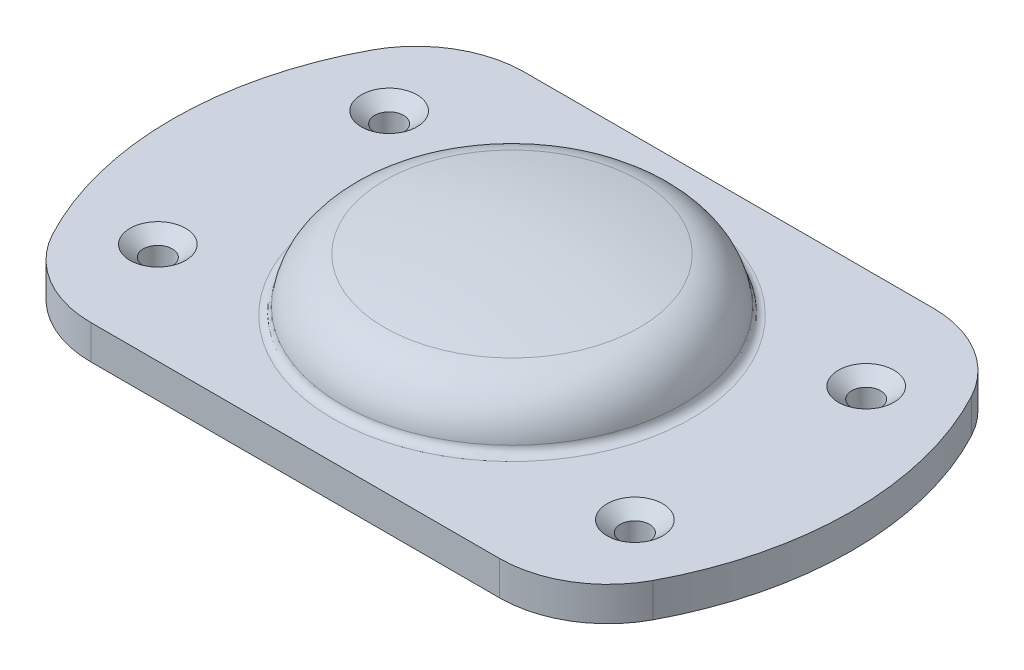
ISO-10303-21;
HEADER;
FILE_DESCRIPTION(('STEP AP214'),'2;1');
FILE_NAME('part.step','',(''),(''),'','','');
FILE_SCHEMA(('AUTOMOTIVE_DESIGN { 1 0 10303 214 1 1 1 1 }'));
ENDSEC;
DATA;
#1=APPLICATION_CONTEXT('core data for automotive mechanical design processes');
#2=APPLICATION_PROTOCOL_DEFINITION('international standard','automotive_design',2000,#1);
#3=PRODUCT_CONTEXT('',#1,'mechanical');
#4=PRODUCT('Part','Part','',(#3));
#5=PRODUCT_RELATED_PRODUCT_CATEGORY('part','',(#4));
#6=PRODUCT_DEFINITION_FORMATION('','',#4);
#7=PRODUCT_DEFINITION_CONTEXT('part definition',#1,'design');
#8=PRODUCT_DEFINITION('design','',#6,#7);
#9=PRODUCT_DEFINITION_SHAPE('','',#8);
#10=(LENGTH_UNIT() NAMED_UNIT(*) SI_UNIT(.MILLI.,.METRE.));
#11=(NAMED_UNIT(*) PLANE_ANGLE_UNIT() SI_UNIT($,.RADIAN.));
#12=(NAMED_UNIT(*) SI_UNIT($,.STERADIAN.) SOLID_ANGLE_UNIT());
#13=UNCERTAINTY_MEASURE_WITH_UNIT(LENGTH_MEASURE(1.E-05),#10,'distance_accuracy_value','');
#14=(GEOMETRIC_REPRESENTATION_CONTEXT(3) GLOBAL_UNCERTAINTY_ASSIGNED_CONTEXT((#13)) GLOBAL_UNIT_ASSIGNED_CONTEXT((#10,
#11,#12)) REPRESENTATION_CONTEXT('',''));
#15=CARTESIAN_POINT('',(0.,0.,0.));
#16=DIRECTION('',(0.,0.,1.));
#17=DIRECTION('',(1.,0.,0.));
#18=AXIS2_PLACEMENT_3D('',#15,#16,#17);
#19=CARTESIAN_POINT('',(-35.8985668237605,0.,-19.05));
#20=DIRECTION('',(0.,-1.,0.));
#21=DIRECTION('',(0.,0.,-1.));
#22=AXIS2_PLACEMENT_3D('',#19,#20,#21);
#23=PLANE('',#22);
#24=CARTESIAN_POINT('',(-41.91,0.,20.32));
#25=DIRECTION('',(0.,1.,0.));
#26=DIRECTION('',(0.,0.,1.));
#27=AXIS2_PLACEMENT_3D('',#24,#25,#26);
#28=CIRCLE('',#27,2.5527);
#29=CARTESIAN_POINT('',(-41.91,0.,22.8727));
#30=VERTEX_POINT('',#29);
#31=EDGE_CURVE('E257',#30,#30,#28,.T.);
#32=ORIENTED_EDGE('',*,*,#31,.T.);
#33=EDGE_LOOP('',(#32));
#34=FACE_BOUND('',#33,.T.);
#35=CARTESIAN_POINT('',(-35.8985668237605,0.,-19.05));
#36=DIRECTION('',(0.,1.,0.));
#37=DIRECTION('',(0.,0.,-1.));
#38=AXIS2_PLACEMENT_3D('',#35,#36,#37);
#39=CIRCLE('',#38,19.05);
#40=CARTESIAN_POINT('',(-35.8985668237605,0.,-38.1));
#41=VERTEX_POINT('',#40);
#42=CARTESIAN_POINT('',(-52.7260200223983,0.,-27.9796875));
#43=VERTEX_POINT('',#42);
#44=EDGE_CURVE('E135',#41,#43,#39,.T.);
#45=ORIENTED_EDGE('',*,*,#44,.F.);
#46=DIRECTION('',(-1.,0.,0.));
#47=VECTOR('',#46,1.);
#48=CARTESIAN_POINT('',(-35.8985668237605,0.,-38.1));
#49=LINE('',#48,#47);
#50=CARTESIAN_POINT('',(35.8985668237605,0.,-38.1));
#51=VERTEX_POINT('',#50);
#52=EDGE_CURVE('E88',#51,#41,#49,.T.);
#53=ORIENTED_EDGE('',*,*,#52,.F.);
#54=CARTESIAN_POINT('',(35.8985668237605,0.,-19.05));
#55=DIRECTION('',(0.,1.,0.));
#56=DIRECTION('',(0.,0.,1.));
#57=AXIS2_PLACEMENT_3D('',#54,#55,#56);
#58=CIRCLE('',#57,19.05);
#59=CARTESIAN_POINT('',(52.7260200223983,0.,-27.9796875));
#60=VERTEX_POINT('',#59);
#61=EDGE_CURVE('E82',#60,#51,#58,.T.);
#62=ORIENTED_EDGE('',*,*,#61,.F.);
#63=CARTESIAN_POINT('',(0.,0.,0.));
#64=DIRECTION('',(0.,1.,0.));
#65=DIRECTION('',(0.,0.,1.));
#66=AXIS2_PLACEMENT_3D('',#63,#64,#65);
#67=CIRCLE('',#66,59.69);
#68=CARTESIAN_POINT('',(52.7260200223982,0.,27.9796875));
#69=VERTEX_POINT('',#68);
#70=EDGE_CURVE('E125',#69,#60,#67,.T.);
#71=ORIENTED_EDGE('',*,*,#70,.F.);
#72=CARTESIAN_POINT('',(35.8985668237605,0.,19.05));
#73=DIRECTION('',(0.,1.,0.));
#74=DIRECTION('',(0.,0.,-1.));
#75=AXIS2_PLACEMENT_3D('',#72,#73,#74);
#76=CIRCLE('',#75,19.05);
#77=CARTESIAN_POINT('',(35.8985668237605,0.,38.1));
#78=VERTEX_POINT('',#77);
#79=EDGE_CURVE('E145',#78,#69,#76,.T.);
#80=ORIENTED_EDGE('',*,*,#79,.F.);
#81=DIRECTION('',(1.,0.,0.));
#82=VECTOR('',#81,1.);
#83=CARTESIAN_POINT('',(-35.8985668237605,0.,38.1));
#84=LINE('',#83,#82);
#85=CARTESIAN_POINT('',(-35.8985668237605,0.,38.1));
#86=VERTEX_POINT('',#85);
#87=EDGE_CURVE('E143',#86,#78,#84,.T.);
#88=ORIENTED_EDGE('',*,*,#87,.F.);
#89=CARTESIAN_POINT('',(-35.8985668237605,0.,19.05));
#90=DIRECTION('',(0.,1.,0.));
#91=DIRECTION('',(0.,0.,1.));
#92=AXIS2_PLACEMENT_3D('',#89,#90,#91);
#93=CIRCLE('',#92,19.05);
#94=CARTESIAN_POINT('',(-52.7260200223983,0.,27.9796875));
#95=VERTEX_POINT('',#94);
#96=EDGE_CURVE('E141',#95,#86,#93,.T.);
#97=ORIENTED_EDGE('',*,*,#96,.F.);
#98=CARTESIAN_POINT('',(0.,0.,0.));
#99=DIRECTION('',(0.,1.,0.));
#100=DIRECTION('',(0.,0.,-1.));
#101=AXIS2_PLACEMENT_3D('',#98,#99,#100);
#102=CIRCLE('',#101,59.69);
#103=EDGE_CURVE('E138',#43,#95,#102,.T.);
#104=ORIENTED_EDGE('',*,*,#103,.F.);
#105=EDGE_LOOP('',(#45,#53,#62,#71,#80,#88,#97,#104));
#106=FACE_BOUND('',#105,.T.);
#107=CARTESIAN_POINT('',(41.91,0.,20.32));
#108=DIRECTION('',(0.,1.,0.));
#109=DIRECTION('',(0.,0.,1.));
#110=AXIS2_PLACEMENT_3D('',#107,#108,#109);
#111=CIRCLE('',#110,2.5527);
#112=CARTESIAN_POINT('',(41.91,0.,22.8727));
#113=VERTEX_POINT('',#112);
#114=EDGE_CURVE('E239',#113,#113,#111,.T.);
#115=ORIENTED_EDGE('',*,*,#114,.T.);
#116=EDGE_LOOP('',(#115));
#117=FACE_BOUND('',#116,.T.);
#118=CARTESIAN_POINT('',(41.91,0.,-20.32));
#119=DIRECTION('',(0.,1.,0.));
#120=DIRECTION('',(0.,0.,1.));
#121=AXIS2_PLACEMENT_3D('',#118,#119,#120);
#122=CIRCLE('',#121,2.5527);
#123=CARTESIAN_POINT('',(41.91,0.,-17.7673));
#124=VERTEX_POINT('',#123);
#125=EDGE_CURVE('E248',#124,#124,#122,.T.);
#126=ORIENTED_EDGE('',*,*,#125,.T.);
#127=EDGE_LOOP('',(#126));
#128=FACE_BOUND('',#127,.T.);
#129=CARTESIAN_POINT('',(-41.91,0.,-20.32));
#130=DIRECTION('',(0.,1.,0.));
#131=DIRECTION('',(0.,0.,1.));
#132=AXIS2_PLACEMENT_3D('',#129,#130,#131);
#133=CIRCLE('',#132,2.5527);
#134=CARTESIAN_POINT('',(-41.91,0.,-17.7673));
#135=VERTEX_POINT('',#134);
#136=EDGE_CURVE('E265',#135,#135,#133,.T.);
#137=ORIENTED_EDGE('',*,*,#136,.T.);
#138=EDGE_LOOP('',(#137));
#139=FACE_BOUND('',#138,.T.);
#140=ADVANCED_FACE('F36',(#34,#106,#117,#128,#139),#23,.T.);
#141=CARTESIAN_POINT('',(-35.8985668237605,5.9944,-19.05));
#142=DIRECTION('',(0.,-1.,0.));
#143=DIRECTION('',(0.,0.,-1.));
#144=AXIS2_PLACEMENT_3D('',#141,#142,#143);
#145=PLANE('',#144);
#146=CARTESIAN_POINT('',(-41.91,5.9944,20.32));
#147=DIRECTION('',(0.,1.,0.));
#148=DIRECTION('',(0.,0.,1.));
#149=AXIS2_PLACEMENT_3D('',#146,#147,#148);
#150=CIRCLE('',#149,4.8895);
#151=CARTESIAN_POINT('',(-41.91,5.9944,25.2095));
#152=VERTEX_POINT('',#151);
#153=EDGE_CURVE('E262',#152,#152,#150,.T.);
#154=ORIENTED_EDGE('',*,*,#153,.F.);
#155=EDGE_LOOP('',(#154));
#156=FACE_BOUND('',#155,.T.);
#157=CARTESIAN_POINT('',(41.91,5.9944,20.32));
#158=DIRECTION('',(0.,1.,0.));
#159=DIRECTION('',(0.,0.,1.));
#160=AXIS2_PLACEMENT_3D('',#157,#158,#159);
#161=CIRCLE('',#160,4.8895);
#162=CARTESIAN_POINT('',(41.91,5.9944,25.2095));
#163=VERTEX_POINT('',#162);
#164=EDGE_CURVE('E245',#163,#163,#161,.T.);
#165=ORIENTED_EDGE('',*,*,#164,.F.);
#166=EDGE_LOOP('',(#165));
#167=FACE_BOUND('',#166,.T.);
#168=CARTESIAN_POINT('',(0.,5.9944,0.));
#169=DIRECTION('',(0.,-1.,0.));
#170=DIRECTION('',(0.,0.,-1.));
#171=AXIS2_PLACEMENT_3D('',#168,#169,#170);
#172=CIRCLE('',#171,31.4709226280624);
#173=CARTESIAN_POINT('',(0.,5.9944,-31.4709226280624));
#174=VERTEX_POINT('',#173);
#175=EDGE_CURVE('E11',#174,#174,#172,.T.);
#176=ORIENTED_EDGE('',*,*,#175,.T.);
#177=EDGE_LOOP('',(#176));
#178=FACE_BOUND('',#177,.T.);
#179=CARTESIAN_POINT('',(-35.8985668237605,5.9944,-19.05));
#180=DIRECTION('',(0.,1.,0.));
#181=DIRECTION('',(0.,0.,-1.));
#182=AXIS2_PLACEMENT_3D('',#179,#180,#181);
#183=CIRCLE('',#182,19.05);
#184=CARTESIAN_POINT('',(-35.8985668237605,5.9944,-38.1));
#185=VERTEX_POINT('',#184);
#186=CARTESIAN_POINT('',(-52.7260200223983,5.9944,-27.9796875));
#187=VERTEX_POINT('',#186);
#188=EDGE_CURVE('E150',#185,#187,#183,.T.);
#189=ORIENTED_EDGE('',*,*,#188,.T.);
#190=CARTESIAN_POINT('',(0.,5.9944,0.));
#191=DIRECTION('',(0.,1.,0.));
#192=DIRECTION('',(0.,0.,-1.));
#193=AXIS2_PLACEMENT_3D('',#190,#191,#192);
#194=CIRCLE('',#193,59.69);
#195=CARTESIAN_POINT('',(-52.7260200223983,5.9944,27.9796875));
#196=VERTEX_POINT('',#195);
#197=EDGE_CURVE('E97',#187,#196,#194,.T.);
#198=ORIENTED_EDGE('',*,*,#197,.T.);
#199=CARTESIAN_POINT('',(-35.8985668237605,5.9944,19.05));
#200=DIRECTION('',(0.,1.,0.));
#201=DIRECTION('',(0.,0.,1.));
#202=AXIS2_PLACEMENT_3D('',#199,#200,#201);
#203=CIRCLE('',#202,19.05);
#204=CARTESIAN_POINT('',(-35.8985668237605,5.9944,38.1));
#205=VERTEX_POINT('',#204);
#206=EDGE_CURVE('E229',#196,#205,#203,.T.);
#207=ORIENTED_EDGE('',*,*,#206,.T.);
#208=DIRECTION('',(1.,0.,0.));
#209=VECTOR('',#208,1.);
#210=CARTESIAN_POINT('',(-35.8985668237605,5.9944,38.1));
#211=LINE('',#210,#209);
#212=CARTESIAN_POINT('',(35.8985668237605,5.9944,38.1));
#213=VERTEX_POINT('',#212);
#214=EDGE_CURVE('E231',#205,#213,#211,.T.);
#215=ORIENTED_EDGE('',*,*,#214,.T.);
#216=CARTESIAN_POINT('',(35.8985668237605,5.9944,19.05));
#217=DIRECTION('',(0.,1.,0.));
#218=DIRECTION('',(0.,0.,-1.));
#219=AXIS2_PLACEMENT_3D('',#216,#217,#218);
#220=CIRCLE('',#219,19.05);
#221=CARTESIAN_POINT('',(52.7260200223982,5.9944,27.9796875));
#222=VERTEX_POINT('',#221);
#223=EDGE_CURVE('E117',#213,#222,#220,.T.);
#224=ORIENTED_EDGE('',*,*,#223,.T.);
#225=CARTESIAN_POINT('',(0.,5.9944,0.));
#226=DIRECTION('',(0.,1.,0.));
#227=DIRECTION('',(0.,0.,1.));
#228=AXIS2_PLACEMENT_3D('',#225,#226,#227);
#229=CIRCLE('',#228,59.69);
#230=CARTESIAN_POINT('',(52.7260200223983,5.9944,-27.9796875));
#231=VERTEX_POINT('',#230);
#232=EDGE_CURVE('E110',#222,#231,#229,.T.);
#233=ORIENTED_EDGE('',*,*,#232,.T.);
#234=CARTESIAN_POINT('',(35.8985668237605,5.9944,-19.05));
#235=DIRECTION('',(0.,1.,0.));
#236=DIRECTION('',(0.,0.,1.));
#237=AXIS2_PLACEMENT_3D('',#234,#235,#236);
#238=CIRCLE('',#237,19.05);
#239=CARTESIAN_POINT('',(35.8985668237605,5.9944,-38.1));
#240=VERTEX_POINT('',#239);
#241=EDGE_CURVE('E115',#231,#240,#238,.T.);
#242=ORIENTED_EDGE('',*,*,#241,.T.);
#243=DIRECTION('',(-1.,0.,0.));
#244=VECTOR('',#243,1.);
#245=CARTESIAN_POINT('',(-35.8985668237605,5.9944,-38.1));
#246=LINE('',#245,#244);
#247=EDGE_CURVE('E53',#240,#185,#246,.T.);
#248=ORIENTED_EDGE('',*,*,#247,.T.);
#249=EDGE_LOOP('',(#189,#198,#207,#215,#224,#233,#242,#248));
#250=FACE_BOUND('',#249,.T.);
#251=CARTESIAN_POINT('',(41.91,5.9944,-20.32));
#252=DIRECTION('',(0.,1.,0.));
#253=DIRECTION('',(0.,0.,1.));
#254=AXIS2_PLACEMENT_3D('',#251,#252,#253);
#255=CIRCLE('',#254,4.8895);
#256=CARTESIAN_POINT('',(41.91,5.9944,-15.4305));
#257=VERTEX_POINT('',#256);
#258=EDGE_CURVE('E254',#257,#257,#255,.T.);
#259=ORIENTED_EDGE('',*,*,#258,.F.);
#260=EDGE_LOOP('',(#259));
#261=FACE_BOUND('',#260,.T.);
#262=CARTESIAN_POINT('',(-41.91,5.9944,-20.32));
#263=DIRECTION('',(0.,1.,0.));
#264=DIRECTION('',(0.,0.,1.));
#265=AXIS2_PLACEMENT_3D('',#262,#263,#264);
#266=CIRCLE('',#265,4.8895);
#267=CARTESIAN_POINT('',(-41.91,5.9944,-15.4305));
#268=VERTEX_POINT('',#267);
#269=EDGE_CURVE('E271',#268,#268,#266,.T.);
#270=ORIENTED_EDGE('',*,*,#269,.F.);
#271=EDGE_LOOP('',(#270));
#272=FACE_BOUND('',#271,.T.);
#273=ADVANCED_FACE('F112',(#156,#167,#178,#250,#261,#272),#145,.F.);
#274=CARTESIAN_POINT('',(-35.8985668237605,5.9944,-19.05));
#275=DIRECTION('',(0.,-1.,0.));
#276=DIRECTION('',(0.,0.,-1.));
#277=AXIS2_PLACEMENT_3D('',#274,#275,#276);
#278=CYLINDRICAL_SURFACE('',#277,19.05);
#279=ORIENTED_EDGE('',*,*,#44,.T.);
#280=DIRECTION('',(0.,-1.,0.));
#281=VECTOR('',#280,1.);
#282=CARTESIAN_POINT('',(-52.7260200223983,5.9944,-27.9796875));
#283=LINE('',#282,#281);
#284=EDGE_CURVE('E163',#187,#43,#283,.T.);
#285=ORIENTED_EDGE('',*,*,#284,.F.);
#286=ORIENTED_EDGE('',*,*,#188,.F.);
#287=DIRECTION('',(0.,-1.,0.));
#288=VECTOR('',#287,1.);
#289=CARTESIAN_POINT('',(-35.8985668237605,5.9944,-38.1));
#290=LINE('',#289,#288);
#291=EDGE_CURVE('E131',#185,#41,#290,.T.);
#292=ORIENTED_EDGE('',*,*,#291,.T.);
#293=EDGE_LOOP('',(#279,#285,#286,#292));
#294=FACE_BOUND('',#293,.T.);
#295=ADVANCED_FACE('F189',(#294),#278,.T.);
#296=CARTESIAN_POINT('',(0.,5.9944,0.));
#297=DIRECTION('',(0.,-1.,0.));
#298=DIRECTION('',(0.,0.,-1.));
#299=AXIS2_PLACEMENT_3D('',#296,#297,#298);
#300=CYLINDRICAL_SURFACE('',#299,59.69);
#301=ORIENTED_EDGE('',*,*,#103,.T.);
#302=DIRECTION('',(0.,-1.,0.));
#303=VECTOR('',#302,1.);
#304=CARTESIAN_POINT('',(-52.7260200223983,5.9944,27.9796875));
#305=LINE('',#304,#303);
#306=EDGE_CURVE('E160',#196,#95,#305,.T.);
#307=ORIENTED_EDGE('',*,*,#306,.F.);
#308=ORIENTED_EDGE('',*,*,#197,.F.);
#309=ORIENTED_EDGE('',*,*,#284,.T.);
#310=EDGE_LOOP('',(#301,#307,#308,#309));
#311=FACE_BOUND('',#310,.T.);
#312=ADVANCED_FACE('F214',(#311),#300,.T.);
#313=CARTESIAN_POINT('',(-35.8985668237605,5.9944,19.05));
#314=DIRECTION('',(0.,-1.,0.));
#315=DIRECTION('',(0.,0.,-1.));
#316=AXIS2_PLACEMENT_3D('',#313,#314,#315);
#317=CYLINDRICAL_SURFACE('',#316,19.05);
#318=ORIENTED_EDGE('',*,*,#96,.T.);
#319=DIRECTION('',(0.,-1.,0.));
#320=VECTOR('',#319,1.);
#321=CARTESIAN_POINT('',(-35.8985668237605,5.9944,38.1));
#322=LINE('',#321,#320);
#323=EDGE_CURVE('E157',#205,#86,#322,.T.);
#324=ORIENTED_EDGE('',*,*,#323,.F.);
#325=ORIENTED_EDGE('',*,*,#206,.F.);
#326=ORIENTED_EDGE('',*,*,#306,.T.);
#327=EDGE_LOOP('',(#318,#324,#325,#326));
#328=FACE_BOUND('',#327,.T.);
#329=ADVANCED_FACE('F210',(#328),#317,.T.);
#330=CARTESIAN_POINT('',(-35.8985668237605,5.9944,38.1));
#331=DIRECTION('',(0.,0.,-1.));
#332=DIRECTION('',(-1.,0.,0.));
#333=AXIS2_PLACEMENT_3D('',#330,#331,#332);
#334=PLANE('',#333);
#335=ORIENTED_EDGE('',*,*,#87,.T.);
#336=DIRECTION('',(0.,-1.,0.));
#337=VECTOR('',#336,1.);
#338=CARTESIAN_POINT('',(35.8985668237605,5.9944,38.1));
#339=LINE('',#338,#337);
#340=EDGE_CURVE('E154',#213,#78,#339,.T.);
#341=ORIENTED_EDGE('',*,*,#340,.F.);
#342=ORIENTED_EDGE('',*,*,#214,.F.);
#343=ORIENTED_EDGE('',*,*,#323,.T.);
#344=EDGE_LOOP('',(#335,#341,#342,#343));
#345=FACE_BOUND('',#344,.T.);
#346=ADVANCED_FACE('F206',(#345),#334,.F.);
#347=CARTESIAN_POINT('',(35.8985668237605,5.9944,19.05));
#348=DIRECTION('',(0.,-1.,0.));
#349=DIRECTION('',(0.,0.,-1.));
#350=AXIS2_PLACEMENT_3D('',#347,#348,#349);
#351=CYLINDRICAL_SURFACE('',#350,19.05);
#352=ORIENTED_EDGE('',*,*,#79,.T.);
#353=DIRECTION('',(0.,-1.,0.));
#354=VECTOR('',#353,1.);
#355=CARTESIAN_POINT('',(52.7260200223982,5.9944,27.9796875));
#356=LINE('',#355,#354);
#357=EDGE_CURVE('E126',#222,#69,#356,.T.);
#358=ORIENTED_EDGE('',*,*,#357,.F.);
#359=ORIENTED_EDGE('',*,*,#223,.F.);
#360=ORIENTED_EDGE('',*,*,#340,.T.);
#361=EDGE_LOOP('',(#352,#358,#359,#360));
#362=FACE_BOUND('',#361,.T.);
#363=ADVANCED_FACE('F203',(#362),#351,.T.);
#364=CARTESIAN_POINT('',(0.,5.9944,0.));
#365=DIRECTION('',(0.,-1.,0.));
#366=DIRECTION('',(0.,0.,-1.));
#367=AXIS2_PLACEMENT_3D('',#364,#365,#366);
#368=CYLINDRICAL_SURFACE('',#367,59.69);
#369=ORIENTED_EDGE('',*,*,#70,.T.);
#370=DIRECTION('',(0.,-1.,0.));
#371=VECTOR('',#370,1.);
#372=CARTESIAN_POINT('',(52.7260200223983,5.9944,-27.9796875));
#373=LINE('',#372,#371);
#374=EDGE_CURVE('E122',#231,#60,#373,.T.);
#375=ORIENTED_EDGE('',*,*,#374,.F.);
#376=ORIENTED_EDGE('',*,*,#232,.F.);
#377=ORIENTED_EDGE('',*,*,#357,.T.);
#378=EDGE_LOOP('',(#369,#375,#376,#377));
#379=FACE_BOUND('',#378,.T.);
#380=ADVANCED_FACE('F123',(#379),#368,.T.);
#381=CARTESIAN_POINT('',(35.8985668237605,5.9944,-19.05));
#382=DIRECTION('',(0.,-1.,0.));
#383=DIRECTION('',(0.,0.,-1.));
#384=AXIS2_PLACEMENT_3D('',#381,#382,#383);
#385=CYLINDRICAL_SURFACE('',#384,19.05);
#386=ORIENTED_EDGE('',*,*,#61,.T.);
#387=DIRECTION('',(0.,-1.,0.));
#388=VECTOR('',#387,1.);
#389=CARTESIAN_POINT('',(35.8985668237605,5.9944,-38.1));
#390=LINE('',#389,#388);
#391=EDGE_CURVE('E127',#240,#51,#390,.T.);
#392=ORIENTED_EDGE('',*,*,#391,.F.);
#393=ORIENTED_EDGE('',*,*,#241,.F.);
#394=ORIENTED_EDGE('',*,*,#374,.T.);
#395=EDGE_LOOP('',(#386,#392,#393,#394));
#396=FACE_BOUND('',#395,.T.);
#397=ADVANCED_FACE('F129',(#396),#385,.T.);
#398=CARTESIAN_POINT('',(-35.8985668237605,5.9944,-38.1));
#399=DIRECTION('',(0.,0.,1.));
#400=DIRECTION('',(1.,0.,0.));
#401=AXIS2_PLACEMENT_3D('',#398,#399,#400);
#402=PLANE('',#401);
#403=ORIENTED_EDGE('',*,*,#52,.T.);
#404=ORIENTED_EDGE('',*,*,#291,.F.);
#405=ORIENTED_EDGE('',*,*,#247,.F.);
#406=ORIENTED_EDGE('',*,*,#391,.T.);
#407=EDGE_LOOP('',(#403,#404,#405,#406));
#408=FACE_BOUND('',#407,.T.);
#409=ADVANCED_FACE('F196',(#408),#402,.F.);
#410=CARTESIAN_POINT('',(0.,-93.5785560975608,0.));
#411=DIRECTION('',(0.,1.,0.));
#412=DIRECTION('',(1.,0.,0.));
#413=AXIS2_PLACEMENT_3D('',#410,#411,#412);
#414=SPHERICAL_SURFACE('',#413,111.180756097561);
#415=CARTESIAN_POINT('',(0.,15.324244597477,0.));
#416=DIRECTION('',(0.,1.,0.));
#417=DIRECTION('',(-1.,0.,0.));
#418=AXIS2_PLACEMENT_3D('',#415,#416,#417);
#419=CIRCLE('',#418,22.3906348101651);
#420=CARTESIAN_POINT('',(-22.3906348101652,15.324244597477,0.));
#421=VERTEX_POINT('',#420);
#422=EDGE_CURVE('E139',#421,#421,#419,.T.);
#423=ORIENTED_EDGE('',*,*,#422,.T.);
#424=EDGE_LOOP('',(#423));
#425=FACE_BOUND('',#424,.T.);
#426=ADVANCED_FACE('F180',(#425),#414,.T.);
#427=CARTESIAN_POINT('',(0.,5.99440000000001,0.));
#428=DIRECTION('',(0.,1.,0.));
#429=DIRECTION('',(-1.,0.,0.));
#430=AXIS2_PLACEMENT_3D('',#427,#428,#429);
#431=TOROIDAL_SURFACE('',#430,20.4724,9.52500000000001);
#432=CARTESIAN_POINT('',(0.,7.35511428571429,0.));
#433=DIRECTION('',(0.,-1.,0.));
#434=DIRECTION('',(0.,0.,-1.));
#435=AXIS2_PLACEMENT_3D('',#432,#433,#434);
#436=CIRCLE('',#435,29.8997051097678);
#437=CARTESIAN_POINT('',(0.,7.35511428571429,-29.8997051097678));
#438=VERTEX_POINT('',#437);
#439=EDGE_CURVE('E45',#438,#438,#436,.F.);
#440=ORIENTED_EDGE('',*,*,#439,.T.);
#441=EDGE_LOOP('',(#440));
#442=FACE_BOUND('',#441,.T.);
#443=ORIENTED_EDGE('',*,*,#422,.F.);
#444=EDGE_LOOP('',(#443));
#445=FACE_BOUND('',#444,.T.);
#446=ADVANCED_FACE('F167',(#442,#445),#431,.T.);
#447=CARTESIAN_POINT('',(0.,7.5819,0.));
#448=DIRECTION('',(0.,-1.,0.));
#449=DIRECTION('',(0.,0.,-1.));
#450=AXIS2_PLACEMENT_3D('',#447,#448,#449);
#451=TOROIDAL_SURFACE('',#450,31.4709226280624,1.5875);
#452=ORIENTED_EDGE('',*,*,#175,.F.);
#453=EDGE_LOOP('',(#452));
#454=FACE_BOUND('',#453,.T.);
#455=ORIENTED_EDGE('',*,*,#439,.F.);
#456=EDGE_LOOP('',(#455));
#457=FACE_BOUND('',#456,.T.);
#458=ADVANCED_FACE('F38',(#454,#457),#451,.F.);
#459=CARTESIAN_POINT('',(41.91,5.9944,20.32));
#460=DIRECTION('',(0.,1.,0.));
#461=DIRECTION('',(0.,0.,1.));
#462=AXIS2_PLACEMENT_3D('',#459,#460,#461);
#463=CYLINDRICAL_SURFACE('',#462,2.5527);
#464=ORIENTED_EDGE('',*,*,#114,.F.);
#465=EDGE_LOOP('',(#464));
#466=FACE_BOUND('',#465,.T.);
#467=CARTESIAN_POINT('',(41.91,4.03359198186492,20.32));
#468=DIRECTION('',(0.,1.,0.));
#469=DIRECTION('',(0.,0.,1.));
#470=AXIS2_PLACEMENT_3D('',#467,#468,#469);
#471=CIRCLE('',#470,2.5527);
#472=CARTESIAN_POINT('',(41.91,4.03359198186492,22.8727));
#473=VERTEX_POINT('',#472);
#474=EDGE_CURVE('E242',#473,#473,#471,.T.);
#475=ORIENTED_EDGE('',*,*,#474,.T.);
#476=EDGE_LOOP('',(#475));
#477=FACE_BOUND('',#476,.T.);
#478=ADVANCED_FACE('F171',(#466,#477),#463,.F.);
#479=CARTESIAN_POINT('',(41.91,5.9944,20.32));
#480=DIRECTION('',(0.,1.,0.));
#481=DIRECTION('',(0.,0.,1.));
#482=AXIS2_PLACEMENT_3D('',#479,#480,#481);
#483=CONICAL_SURFACE('',#482,4.8895,0.872664625997163);
#484=ORIENTED_EDGE('',*,*,#474,.F.);
#485=EDGE_LOOP('',(#484));
#486=FACE_BOUND('',#485,.T.);
#487=ORIENTED_EDGE('',*,*,#164,.T.);
#488=EDGE_LOOP('',(#487));
#489=FACE_BOUND('',#488,.T.);
#490=ADVANCED_FACE('F177',(#486,#489),#483,.F.);
#491=CARTESIAN_POINT('',(41.91,5.9944,-20.32));
#492=DIRECTION('',(0.,1.,0.));
#493=DIRECTION('',(0.,0.,1.));
#494=AXIS2_PLACEMENT_3D('',#491,#492,#493);
#495=CYLINDRICAL_SURFACE('',#494,2.5527);
#496=ORIENTED_EDGE('',*,*,#125,.F.);
#497=EDGE_LOOP('',(#496));
#498=FACE_BOUND('',#497,.T.);
#499=CARTESIAN_POINT('',(41.91,4.03359198186492,-20.32));
#500=DIRECTION('',(0.,1.,0.));
#501=DIRECTION('',(0.,0.,1.));
#502=AXIS2_PLACEMENT_3D('',#499,#500,#501);
#503=CIRCLE('',#502,2.5527);
#504=CARTESIAN_POINT('',(41.91,4.03359198186492,-17.7673));
#505=VERTEX_POINT('',#504);
#506=EDGE_CURVE('E251',#505,#505,#503,.T.);
#507=ORIENTED_EDGE('',*,*,#506,.T.);
#508=EDGE_LOOP('',(#507));
#509=FACE_BOUND('',#508,.T.);
#510=ADVANCED_FACE('F299',(#498,#509),#495,.F.);
#511=CARTESIAN_POINT('',(41.91,5.9944,-20.32));
#512=DIRECTION('',(0.,1.,0.));
#513=DIRECTION('',(0.,0.,1.));
#514=AXIS2_PLACEMENT_3D('',#511,#512,#513);
#515=CONICAL_SURFACE('',#514,4.8895,0.872664625997163);
#516=ORIENTED_EDGE('',*,*,#506,.F.);
#517=EDGE_LOOP('',(#516));
#518=FACE_BOUND('',#517,.T.);
#519=ORIENTED_EDGE('',*,*,#258,.T.);
#520=EDGE_LOOP('',(#519));
#521=FACE_BOUND('',#520,.T.);
#522=ADVANCED_FACE('F295',(#518,#521),#515,.F.);
#523=CARTESIAN_POINT('',(-41.91,5.9944,20.32));
#524=DIRECTION('',(0.,1.,0.));
#525=DIRECTION('',(0.,0.,1.));
#526=AXIS2_PLACEMENT_3D('',#523,#524,#525);
#527=CYLINDRICAL_SURFACE('',#526,2.5527);
#528=ORIENTED_EDGE('',*,*,#31,.F.);
#529=EDGE_LOOP('',(#528));
#530=FACE_BOUND('',#529,.T.);
#531=CARTESIAN_POINT('',(-41.91,4.03359198186492,20.32));
#532=DIRECTION('',(0.,1.,0.));
#533=DIRECTION('',(0.,0.,1.));
#534=AXIS2_PLACEMENT_3D('',#531,#532,#533);
#535=CIRCLE('',#534,2.5527);
#536=CARTESIAN_POINT('',(-41.91,4.03359198186492,22.8727));
#537=VERTEX_POINT('',#536);
#538=EDGE_CURVE('E259',#537,#537,#535,.T.);
#539=ORIENTED_EDGE('',*,*,#538,.T.);
#540=EDGE_LOOP('',(#539));
#541=FACE_BOUND('',#540,.T.);
#542=ADVANCED_FACE('F291',(#530,#541),#527,.F.);
#543=CARTESIAN_POINT('',(-41.91,5.9944,20.32));
#544=DIRECTION('',(0.,1.,0.));
#545=DIRECTION('',(0.,0.,1.));
#546=AXIS2_PLACEMENT_3D('',#543,#544,#545);
#547=CONICAL_SURFACE('',#546,4.8895,0.872664625997163);
#548=ORIENTED_EDGE('',*,*,#538,.F.);
#549=EDGE_LOOP('',(#548));
#550=FACE_BOUND('',#549,.T.);
#551=ORIENTED_EDGE('',*,*,#153,.T.);
#552=EDGE_LOOP('',(#551));
#553=FACE_BOUND('',#552,.T.);
#554=ADVANCED_FACE('F284',(#550,#553),#547,.F.);
#555=CARTESIAN_POINT('',(-41.91,5.9944,-20.32));
#556=DIRECTION('',(0.,1.,0.));
#557=DIRECTION('',(0.,0.,1.));
#558=AXIS2_PLACEMENT_3D('',#555,#556,#557);
#559=CYLINDRICAL_SURFACE('',#558,2.5527);
#560=ORIENTED_EDGE('',*,*,#136,.F.);
#561=EDGE_LOOP('',(#560));
#562=FACE_BOUND('',#561,.T.);
#563=CARTESIAN_POINT('',(-41.91,4.03359198186492,-20.32));
#564=DIRECTION('',(0.,1.,0.));
#565=DIRECTION('',(0.,0.,1.));
#566=AXIS2_PLACEMENT_3D('',#563,#564,#565);
#567=CIRCLE('',#566,2.5527);
#568=CARTESIAN_POINT('',(-41.91,4.03359198186492,-17.7673));
#569=VERTEX_POINT('',#568);
#570=EDGE_CURVE('E268',#569,#569,#567,.T.);
#571=ORIENTED_EDGE('',*,*,#570,.T.);
#572=EDGE_LOOP('',(#571));
#573=FACE_BOUND('',#572,.T.);
#574=ADVANCED_FACE('F278',(#562,#573),#559,.F.);
#575=CARTESIAN_POINT('',(-41.91,5.9944,-20.32));
#576=DIRECTION('',(0.,1.,0.));
#577=DIRECTION('',(0.,0.,1.));
#578=AXIS2_PLACEMENT_3D('',#575,#576,#577);
#579=CONICAL_SURFACE('',#578,4.8895,0.872664625997163);
#580=ORIENTED_EDGE('',*,*,#570,.F.);
#581=EDGE_LOOP('',(#580));
#582=FACE_BOUND('',#581,.T.);
#583=ORIENTED_EDGE('',*,*,#269,.T.);
#584=EDGE_LOOP('',(#583));
#585=FACE_BOUND('',#584,.T.);
#586=ADVANCED_FACE('F275',(#582,#585),#579,.F.);
#587=CLOSED_SHELL('',(#140,#273,#295,#312,#329,#346,#363,#380,#397,#409,#426,#446,#458,#478,
#490,#510,#522,#542,#554,#574,#586));
#588=MANIFOLD_SOLID_BREP('B2',#587);
#589=ADVANCED_BREP_SHAPE_REPRESENTATION('',(#18,#588),#14);
#590=SHAPE_DEFINITION_REPRESENTATION(#9,#589);
ENDSEC;
END-ISO-10303-21;
